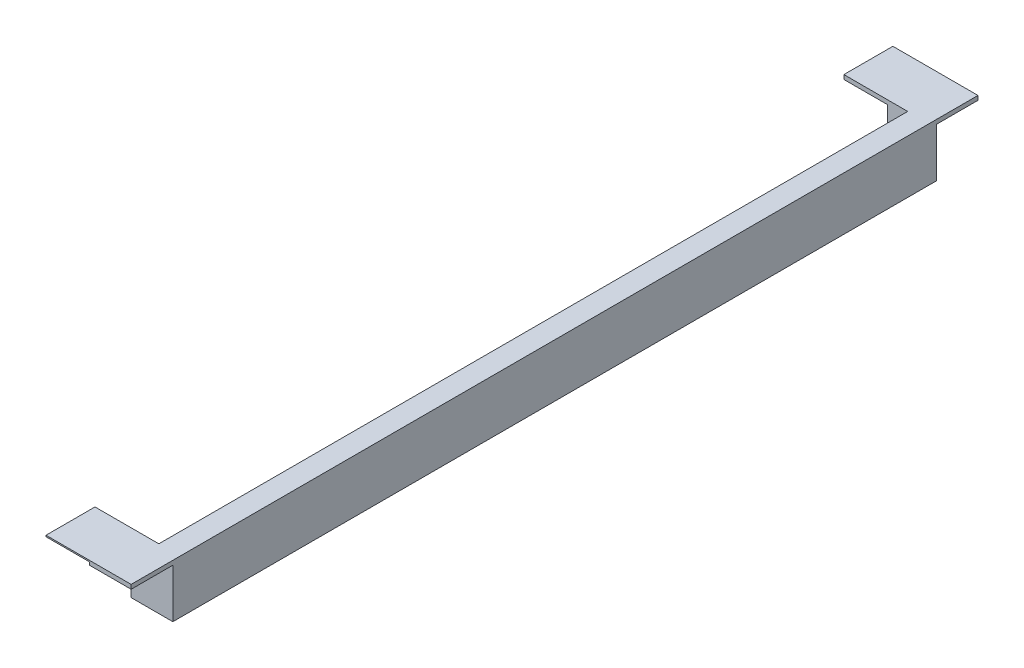
ISO-10303-21;
HEADER;
FILE_DESCRIPTION(('STEP AP214'),'2;1');
FILE_NAME('part.step','',(''),(''),'','','');
FILE_SCHEMA(('AUTOMOTIVE_DESIGN { 1 0 10303 214 1 1 1 1 }'));
ENDSEC;
DATA;
#1=APPLICATION_CONTEXT('core data for automotive mechanical design processes');
#2=APPLICATION_PROTOCOL_DEFINITION('international standard','automotive_design',2000,#1);
#3=PRODUCT_CONTEXT('',#1,'mechanical');
#4=PRODUCT('Part','Part','',(#3));
#5=PRODUCT_RELATED_PRODUCT_CATEGORY('part','',(#4));
#6=PRODUCT_DEFINITION_FORMATION('','',#4);
#7=PRODUCT_DEFINITION_CONTEXT('part definition',#1,'design');
#8=PRODUCT_DEFINITION('design','',#6,#7);
#9=PRODUCT_DEFINITION_SHAPE('','',#8);
#10=(LENGTH_UNIT() NAMED_UNIT(*) SI_UNIT(.MILLI.,.METRE.));
#11=(NAMED_UNIT(*) PLANE_ANGLE_UNIT() SI_UNIT($,.RADIAN.));
#12=(NAMED_UNIT(*) SI_UNIT($,.STERADIAN.) SOLID_ANGLE_UNIT());
#13=UNCERTAINTY_MEASURE_WITH_UNIT(LENGTH_MEASURE(1.E-05),#10,'distance_accuracy_value','');
#14=(GEOMETRIC_REPRESENTATION_CONTEXT(3) GLOBAL_UNCERTAINTY_ASSIGNED_CONTEXT((#13)) GLOBAL_UNIT_ASSIGNED_CONTEXT((#10,
#11,#12)) REPRESENTATION_CONTEXT('',''));
#15=CARTESIAN_POINT('',(0.,0.,0.));
#16=DIRECTION('',(0.,0.,1.));
#17=DIRECTION('',(1.,0.,0.));
#18=AXIS2_PLACEMENT_3D('',#15,#16,#17);
#19=CARTESIAN_POINT('',(83.5070619854824,-52.5,915.005527691364));
#20=DIRECTION('',(0.,-1.,0.));
#21=DIRECTION('',(1.,0.,0.));
#22=AXIS2_PLACEMENT_3D('',#19,#20,#21);
#23=PLANE('',#22);
#24=DIRECTION('',(0.,0.,1.));
#25=VECTOR('',#24,1.);
#26=CARTESIAN_POINT('',(33.5070619854824,-52.5,35.3555276913635));
#27=LINE('',#26,#25);
#28=CARTESIAN_POINT('',(33.5070619854824,-52.5,35.3555276913635));
#29=VERTEX_POINT('',#28);
#30=CARTESIAN_POINT('',(33.5070619854824,-52.5,1794.65552769136));
#31=VERTEX_POINT('',#30);
#32=EDGE_CURVE('E55',#29,#31,#27,.T.);
#33=ORIENTED_EDGE('',*,*,#32,.F.);
#34=DIRECTION('',(1.,0.,0.));
#35=VECTOR('',#34,1.);
#36=CARTESIAN_POINT('',(-14.4929380145176,-52.5,35.3555276913635));
#37=LINE('',#36,#35);
#38=CARTESIAN_POINT('',(-14.4929380145176,-52.5,35.3555276913637));
#39=VERTEX_POINT('',#38);
#40=EDGE_CURVE('E213',#39,#29,#37,.T.);
#41=ORIENTED_EDGE('',*,*,#40,.F.);
#42=DIRECTION('',(0.,0.,-1.));
#43=VECTOR('',#42,1.);
#44=CARTESIAN_POINT('',(-14.4929380145176,-52.5,915.005527691364));
#45=LINE('',#44,#43);
#46=CARTESIAN_POINT('',(-14.4929380145176,-52.5,1794.65552769136));
#47=VERTEX_POINT('',#46);
#48=EDGE_CURVE('E256',#47,#39,#45,.T.);
#49=ORIENTED_EDGE('',*,*,#48,.F.);
#50=DIRECTION('',(-1.,0.,0.));
#51=VECTOR('',#50,1.);
#52=CARTESIAN_POINT('',(83.5070619854824,-52.5,1794.65552769136));
#53=LINE('',#52,#51);
#54=EDGE_CURVE('E202',#31,#47,#53,.T.);
#55=ORIENTED_EDGE('',*,*,#54,.F.);
#56=EDGE_LOOP('',(#33,#41,#49,#55));
#57=FACE_BOUND('',#56,.T.);
#58=ADVANCED_FACE('F38',(#57),#23,.F.);
#59=CARTESIAN_POINT('',(0.,0.,35.3555276913635));
#60=DIRECTION('',(0.,0.,1.));
#61=DIRECTION('',(1.,0.,0.));
#62=AXIS2_PLACEMENT_3D('',#59,#60,#61);
#63=PLANE('',#62);
#64=ORIENTED_EDGE('',*,*,#40,.T.);
#65=DIRECTION('',(0.,-1.,0.));
#66=VECTOR('',#65,1.);
#67=CARTESIAN_POINT('',(33.5070619854822,1770.01036644674,35.3555276913635));
#68=LINE('',#67,#66);
#69=CARTESIAN_POINT('',(33.5070619854824,10.,35.3555276913635));
#70=VERTEX_POINT('',#69);
#71=EDGE_CURVE('E62',#70,#29,#68,.T.);
#72=ORIENTED_EDGE('',*,*,#71,.F.);
#73=DIRECTION('',(-1.,0.,0.));
#74=VECTOR('',#73,1.);
#75=CARTESIAN_POINT('',(-14.4929380145176,10.,35.3555276913635));
#76=LINE('',#75,#74);
#77=CARTESIAN_POINT('',(-116.492938014518,10.,35.3555276913636));
#78=VERTEX_POINT('',#77);
#79=EDGE_CURVE('E216',#70,#78,#76,.T.);
#80=ORIENTED_EDGE('',*,*,#79,.T.);
#81=DIRECTION('',(0.,1.,0.));
#82=VECTOR('',#81,1.);
#83=CARTESIAN_POINT('',(-116.492938014518,10.,35.3555276913636));
#84=LINE('',#83,#82);
#85=CARTESIAN_POINT('',(-116.492938014518,0.,35.3555276913635));
#86=VERTEX_POINT('',#85);
#87=EDGE_CURVE('E190',#86,#78,#84,.T.);
#88=ORIENTED_EDGE('',*,*,#87,.F.);
#89=DIRECTION('',(1.,0.,0.));
#90=VECTOR('',#89,1.);
#91=CARTESIAN_POINT('',(-116.492938014518,0.,35.3555276913635));
#92=LINE('',#91,#90);
#93=CARTESIAN_POINT('',(-14.4929380145176,0.,35.3555276913635));
#94=VERTEX_POINT('',#93);
#95=EDGE_CURVE('E197',#86,#94,#92,.T.);
#96=ORIENTED_EDGE('',*,*,#95,.T.);
#97=DIRECTION('',(0.,-1.,0.));
#98=VECTOR('',#97,1.);
#99=CARTESIAN_POINT('',(-14.4929380145176,10.,35.3555276913635));
#100=LINE('',#99,#98);
#101=EDGE_CURVE('E210',#94,#39,#100,.T.);
#102=ORIENTED_EDGE('',*,*,#101,.T.);
#103=EDGE_LOOP('',(#64,#72,#80,#88,#96,#102));
#104=FACE_BOUND('',#103,.T.);
#105=ADVANCED_FACE('F330',(#104),#63,.T.);
#106=CARTESIAN_POINT('',(0.,0.,1794.65552769136));
#107=DIRECTION('',(0.,0.,-1.));
#108=DIRECTION('',(-1.,0.,0.));
#109=AXIS2_PLACEMENT_3D('',#106,#107,#108);
#110=PLANE('',#109);
#111=DIRECTION('',(1.,0.,0.));
#112=VECTOR('',#111,1.);
#113=CARTESIAN_POINT('',(83.5070619854824,10.,1794.65552769136));
#114=LINE('',#113,#112);
#115=CARTESIAN_POINT('',(-116.492938014517,10.,1794.65552769136));
#116=VERTEX_POINT('',#115);
#117=CARTESIAN_POINT('',(33.5070619854824,10.,1794.65552769136));
#118=VERTEX_POINT('',#117);
#119=EDGE_CURVE('E207',#116,#118,#114,.T.);
#120=ORIENTED_EDGE('',*,*,#119,.T.);
#121=DIRECTION('',(0.,-1.,0.));
#122=VECTOR('',#121,1.);
#123=CARTESIAN_POINT('',(33.5070619854824,1770.01036644674,1794.65552769136));
#124=LINE('',#123,#122);
#125=EDGE_CURVE('E389',#118,#31,#124,.T.);
#126=ORIENTED_EDGE('',*,*,#125,.T.);
#127=ORIENTED_EDGE('',*,*,#54,.T.);
#128=DIRECTION('',(0.,1.,0.));
#129=VECTOR('',#128,1.);
#130=CARTESIAN_POINT('',(-14.4929380145176,10.,1794.65552769136));
#131=LINE('',#130,#129);
#132=CARTESIAN_POINT('',(-14.4929380145173,6.8,1794.65552769136));
#133=VERTEX_POINT('',#132);
#134=EDGE_CURVE('E175',#47,#133,#131,.T.);
#135=ORIENTED_EDGE('',*,*,#134,.T.);
#136=DIRECTION('',(1.,0.,0.));
#137=VECTOR('',#136,1.);
#138=CARTESIAN_POINT('',(-116.492938014517,6.8,1794.65552769136));
#139=LINE('',#138,#137);
#140=CARTESIAN_POINT('',(-116.492938014517,6.8,1794.65552769136));
#141=VERTEX_POINT('',#140);
#142=EDGE_CURVE('E152',#141,#133,#139,.T.);
#143=ORIENTED_EDGE('',*,*,#142,.F.);
#144=DIRECTION('',(0.,-1.,0.));
#145=VECTOR('',#144,1.);
#146=CARTESIAN_POINT('',(-116.492938014517,10.,1794.65552769136));
#147=LINE('',#146,#145);
#148=EDGE_CURVE('E161',#116,#141,#147,.T.);
#149=ORIENTED_EDGE('',*,*,#148,.F.);
#150=EDGE_LOOP('',(#120,#126,#127,#135,#143,#149));
#151=FACE_BOUND('',#150,.T.);
#152=ADVANCED_FACE('F173',(#151),#110,.T.);
#153=CARTESIAN_POINT('',(-14.4929380145176,10.,-79.7444723086365));
#154=DIRECTION('',(1.,0.,0.));
#155=DIRECTION('',(0.,0.,-1.));
#156=AXIS2_PLACEMENT_3D('',#153,#154,#155);
#157=PLANE('',#156);
#158=DIRECTION('',(0.,0.,1.));
#159=VECTOR('',#158,1.);
#160=CARTESIAN_POINT('',(-14.4929380145173,6.8,1794.65552769136));
#161=LINE('',#160,#159);
#162=CARTESIAN_POINT('',(-14.4929380145173,6.8,1909.75552769136));
#163=VERTEX_POINT('',#162);
#164=EDGE_CURVE('E170',#133,#163,#161,.T.);
#165=ORIENTED_EDGE('',*,*,#164,.F.);
#166=ORIENTED_EDGE('',*,*,#134,.F.);
#167=ORIENTED_EDGE('',*,*,#48,.T.);
#168=ORIENTED_EDGE('',*,*,#101,.F.);
#169=DIRECTION('',(0.,0.,1.));
#170=VECTOR('',#169,1.);
#171=CARTESIAN_POINT('',(-14.4929380145176,0.,-79.7444723086365));
#172=LINE('',#171,#170);
#173=CARTESIAN_POINT('',(-14.4929380145176,0.,18.2555276913635));
#174=VERTEX_POINT('',#173);
#175=EDGE_CURVE('E11',#174,#94,#172,.T.);
#176=ORIENTED_EDGE('',*,*,#175,.F.);
#177=DIRECTION('',(0.,-1.,0.));
#178=VECTOR('',#177,1.);
#179=CARTESIAN_POINT('',(-14.4929380145176,10.,18.2555276913635));
#180=LINE('',#179,#178);
#181=CARTESIAN_POINT('',(-14.4929380145175,-115.,18.2555276913635));
#182=VERTEX_POINT('',#181);
#183=EDGE_CURVE('E260',#174,#182,#180,.T.);
#184=ORIENTED_EDGE('',*,*,#183,.T.);
#185=DIRECTION('',(0.,0.,-1.));
#186=VECTOR('',#185,1.);
#187=CARTESIAN_POINT('',(-14.4929380145175,-115.,28.2555276913635));
#188=LINE('',#187,#186);
#189=CARTESIAN_POINT('',(-14.4929380145175,-115.,1811.75552769136));
#190=VERTEX_POINT('',#189);
#191=EDGE_CURVE('E274',#190,#182,#188,.T.);
#192=ORIENTED_EDGE('',*,*,#191,.F.);
#193=DIRECTION('',(0.,-1.,0.));
#194=VECTOR('',#193,1.);
#195=CARTESIAN_POINT('',(-14.4929380145176,10.,1811.75552769136));
#196=LINE('',#195,#194);
#197=CARTESIAN_POINT('',(-14.4929380145176,0.,1811.75552769136));
#198=VERTEX_POINT('',#197);
#199=EDGE_CURVE('E219',#198,#190,#196,.T.);
#200=ORIENTED_EDGE('',*,*,#199,.F.);
#201=DIRECTION('',(0.,0.,-1.));
#202=VECTOR('',#201,1.);
#203=CARTESIAN_POINT('',(-14.4929380145176,0.,1909.75552769136));
#204=LINE('',#203,#202);
#205=CARTESIAN_POINT('',(-14.4929380145176,0.,1909.75552769136));
#206=VERTEX_POINT('',#205);
#207=EDGE_CURVE('E231',#206,#198,#204,.T.);
#208=ORIENTED_EDGE('',*,*,#207,.F.);
#209=DIRECTION('',(0.,-1.,0.));
#210=VECTOR('',#209,1.);
#211=CARTESIAN_POINT('',(-14.4929380145176,10.,1909.75552769136));
#212=LINE('',#211,#210);
#213=EDGE_CURVE('E235',#163,#206,#212,.T.);
#214=ORIENTED_EDGE('',*,*,#213,.F.);
#215=EDGE_LOOP('',(#165,#166,#167,#168,#176,#184,#192,#200,#208,#214));
#216=FACE_BOUND('',#215,.T.);
#217=ADVANCED_FACE('F40',(#216),#157,.F.);
#218=CARTESIAN_POINT('',(83.5070619854824,10.,-79.7444723086365));
#219=DIRECTION('',(-1.,0.,0.));
#220=DIRECTION('',(0.,0.,1.));
#221=AXIS2_PLACEMENT_3D('',#218,#219,#220);
#222=PLANE('',#221);
#223=DIRECTION('',(0.,0.,-1.));
#224=VECTOR('',#223,1.);
#225=CARTESIAN_POINT('',(83.5070619854824,10.,-79.7444723086365));
#226=LINE('',#225,#224);
#227=CARTESIAN_POINT('',(83.5070619854824,10.,1909.75552769136));
#228=VERTEX_POINT('',#227);
#229=CARTESIAN_POINT('',(83.5070619854824,10.,-79.7444723086365));
#230=VERTEX_POINT('',#229);
#231=EDGE_CURVE('E279',#228,#230,#226,.T.);
#232=ORIENTED_EDGE('',*,*,#231,.F.);
#233=DIRECTION('',(0.,-1.,0.));
#234=VECTOR('',#233,1.);
#235=CARTESIAN_POINT('',(83.5070619854824,10.,1909.75552769136));
#236=LINE('',#235,#234);
#237=CARTESIAN_POINT('',(83.5070619854824,0.,1909.75552769136));
#238=VERTEX_POINT('',#237);
#239=EDGE_CURVE('E252',#228,#238,#236,.T.);
#240=ORIENTED_EDGE('',*,*,#239,.T.);
#241=DIRECTION('',(0.,0.,1.));
#242=VECTOR('',#241,1.);
#243=CARTESIAN_POINT('',(83.5070619854824,0.,1909.75552769136));
#244=LINE('',#243,#242);
#245=CARTESIAN_POINT('',(83.5070619854824,0.,1811.75552769136));
#246=VERTEX_POINT('',#245);
#247=EDGE_CURVE('E243',#246,#238,#244,.T.);
#248=ORIENTED_EDGE('',*,*,#247,.F.);
#249=DIRECTION('',(0.,1.,0.));
#250=VECTOR('',#249,1.);
#251=CARTESIAN_POINT('',(83.5070619854824,10.,1811.75552769136));
#252=LINE('',#251,#250);
#253=CARTESIAN_POINT('',(83.5070619854824,-115.,1811.75552769136));
#254=VERTEX_POINT('',#253);
#255=EDGE_CURVE('E227',#254,#246,#252,.T.);
#256=ORIENTED_EDGE('',*,*,#255,.F.);
#257=DIRECTION('',(0.,0.,-1.));
#258=VECTOR('',#257,1.);
#259=CARTESIAN_POINT('',(83.5070619854824,-115.,28.2555276913635));
#260=LINE('',#259,#258);
#261=CARTESIAN_POINT('',(83.5070619854824,-115.,18.2555276913635));
#262=VERTEX_POINT('',#261);
#263=EDGE_CURVE('E270',#254,#262,#260,.T.);
#264=ORIENTED_EDGE('',*,*,#263,.T.);
#265=DIRECTION('',(0.,1.,0.));
#266=VECTOR('',#265,1.);
#267=CARTESIAN_POINT('',(83.5070619854824,10.,18.2555276913635));
#268=LINE('',#267,#266);
#269=CARTESIAN_POINT('',(83.5070619854824,0.,18.2555276913635));
#270=VERTEX_POINT('',#269);
#271=EDGE_CURVE('E266',#262,#270,#268,.T.);
#272=ORIENTED_EDGE('',*,*,#271,.T.);
#273=DIRECTION('',(0.,0.,-1.));
#274=VECTOR('',#273,1.);
#275=CARTESIAN_POINT('',(83.5070619854824,0.,-79.7444723086365));
#276=LINE('',#275,#274);
#277=CARTESIAN_POINT('',(83.5070619854824,0.,-79.7444723086365));
#278=VERTEX_POINT('',#277);
#279=EDGE_CURVE('E289',#270,#278,#276,.T.);
#280=ORIENTED_EDGE('',*,*,#279,.T.);
#281=DIRECTION('',(0.,-1.,0.));
#282=VECTOR('',#281,1.);
#283=CARTESIAN_POINT('',(83.5070619854824,10.,-79.7444723086365));
#284=LINE('',#283,#282);
#285=EDGE_CURVE('E42',#230,#278,#284,.T.);
#286=ORIENTED_EDGE('',*,*,#285,.F.);
#287=EDGE_LOOP('',(#232,#240,#248,#256,#264,#272,#280,#286));
#288=FACE_BOUND('',#287,.T.);
#289=ADVANCED_FACE('F316',(#288),#222,.F.);
#290=CARTESIAN_POINT('',(-14.4929380145176,10.,-79.7444723086365));
#291=DIRECTION('',(0.,0.,1.));
#292=DIRECTION('',(1.,0.,0.));
#293=AXIS2_PLACEMENT_3D('',#290,#291,#292);
#294=PLANE('',#293);
#295=DIRECTION('',(-1.,0.,0.));
#296=VECTOR('',#295,1.);
#297=CARTESIAN_POINT('',(-14.4929380145176,0.,-79.7444723086365));
#298=LINE('',#297,#296);
#299=CARTESIAN_POINT('',(-116.492938014518,0.,-79.7444723086365));
#300=VERTEX_POINT('',#299);
#301=EDGE_CURVE('E283',#278,#300,#298,.T.);
#302=ORIENTED_EDGE('',*,*,#301,.T.);
#303=DIRECTION('',(0.,-1.,0.));
#304=VECTOR('',#303,1.);
#305=CARTESIAN_POINT('',(-116.492938014518,10.,-79.7444723086365));
#306=LINE('',#305,#304);
#307=CARTESIAN_POINT('',(-116.492938014518,10.,-79.7444723086365));
#308=VERTEX_POINT('',#307);
#309=EDGE_CURVE('E177',#308,#300,#306,.T.);
#310=ORIENTED_EDGE('',*,*,#309,.F.);
#311=DIRECTION('',(-1.,0.,0.));
#312=VECTOR('',#311,1.);
#313=CARTESIAN_POINT('',(-14.4929380145176,10.,-79.7444723086365));
#314=LINE('',#313,#312);
#315=EDGE_CURVE('E282',#230,#308,#314,.T.);
#316=ORIENTED_EDGE('',*,*,#315,.F.);
#317=ORIENTED_EDGE('',*,*,#285,.T.);
#318=EDGE_LOOP('',(#302,#310,#316,#317));
#319=FACE_BOUND('',#318,.T.);
#320=ADVANCED_FACE('F298',(#319),#294,.F.);
#321=CARTESIAN_POINT('',(0.,10.,0.));
#322=DIRECTION('',(0.,1.,0.));
#323=DIRECTION('',(0.,0.,1.));
#324=AXIS2_PLACEMENT_3D('',#321,#322,#323);
#325=PLANE('',#324);
#326=ORIENTED_EDGE('',*,*,#315,.T.);
#327=DIRECTION('',(0.,0.,-1.));
#328=VECTOR('',#327,1.);
#329=CARTESIAN_POINT('',(-116.492938014518,10.,-79.7444723086365));
#330=LINE('',#329,#328);
#331=EDGE_CURVE('E194',#78,#308,#330,.T.);
#332=ORIENTED_EDGE('',*,*,#331,.F.);
#333=ORIENTED_EDGE('',*,*,#79,.F.);
#334=DIRECTION('',(0.,0.,1.));
#335=VECTOR('',#334,1.);
#336=CARTESIAN_POINT('',(33.5070619854824,10.,35.3555276913635));
#337=LINE('',#336,#335);
#338=EDGE_CURVE('E386',#70,#118,#337,.T.);
#339=ORIENTED_EDGE('',*,*,#338,.T.);
#340=ORIENTED_EDGE('',*,*,#119,.F.);
#341=DIRECTION('',(0.,0.,-1.));
#342=VECTOR('',#341,1.);
#343=CARTESIAN_POINT('',(-116.492938014517,10.,1794.65552769136));
#344=LINE('',#343,#342);
#345=CARTESIAN_POINT('',(-116.492938014517,10.,1909.75552769136));
#346=VERTEX_POINT('',#345);
#347=EDGE_CURVE('E167',#346,#116,#344,.T.);
#348=ORIENTED_EDGE('',*,*,#347,.F.);
#349=DIRECTION('',(-1.,0.,0.));
#350=VECTOR('',#349,1.);
#351=CARTESIAN_POINT('',(-14.4929380145176,10.,1909.75552769136));
#352=LINE('',#351,#350);
#353=EDGE_CURVE('E232',#228,#346,#352,.T.);
#354=ORIENTED_EDGE('',*,*,#353,.F.);
#355=ORIENTED_EDGE('',*,*,#231,.T.);
#356=EDGE_LOOP('',(#326,#332,#333,#339,#340,#348,#354,#355));
#357=FACE_BOUND('',#356,.T.);
#358=ADVANCED_FACE('F310',(#357),#325,.T.);
#359=CARTESIAN_POINT('',(0.,0.,0.));
#360=DIRECTION('',(0.,1.,0.));
#361=DIRECTION('',(0.,0.,1.));
#362=AXIS2_PLACEMENT_3D('',#359,#360,#361);
#363=PLANE('',#362);
#364=DIRECTION('',(1.,0.,0.));
#365=VECTOR('',#364,1.);
#366=CARTESIAN_POINT('',(-14.4929380145176,0.,18.2555276913635));
#367=LINE('',#366,#365);
#368=EDGE_CURVE('E278',#174,#270,#367,.T.);
#369=ORIENTED_EDGE('',*,*,#368,.F.);
#370=ORIENTED_EDGE('',*,*,#175,.T.);
#371=ORIENTED_EDGE('',*,*,#95,.F.);
#372=DIRECTION('',(0.,0.,1.));
#373=VECTOR('',#372,1.);
#374=CARTESIAN_POINT('',(-116.492938014518,0.,-79.7444723086365));
#375=LINE('',#374,#373);
#376=EDGE_CURVE('E183',#300,#86,#375,.T.);
#377=ORIENTED_EDGE('',*,*,#376,.F.);
#378=ORIENTED_EDGE('',*,*,#301,.F.);
#379=ORIENTED_EDGE('',*,*,#279,.F.);
#380=EDGE_LOOP('',(#369,#370,#371,#377,#378,#379));
#381=FACE_BOUND('',#380,.T.);
#382=ADVANCED_FACE('F304',(#381),#363,.F.);
#383=CARTESIAN_POINT('',(0.,0.,18.2555276913635));
#384=DIRECTION('',(0.,0.,1.));
#385=DIRECTION('',(1.,0.,0.));
#386=AXIS2_PLACEMENT_3D('',#383,#384,#385);
#387=PLANE('',#386);
#388=ORIENTED_EDGE('',*,*,#183,.F.);
#389=ORIENTED_EDGE('',*,*,#368,.T.);
#390=ORIENTED_EDGE('',*,*,#271,.F.);
#391=DIRECTION('',(1.,0.,0.));
#392=VECTOR('',#391,1.);
#393=CARTESIAN_POINT('',(-14.4929380145175,-115.,18.2555276913635));
#394=LINE('',#393,#392);
#395=EDGE_CURVE('E263',#182,#262,#394,.T.);
#396=ORIENTED_EDGE('',*,*,#395,.F.);
#397=EDGE_LOOP('',(#388,#389,#390,#396));
#398=FACE_BOUND('',#397,.T.);
#399=ADVANCED_FACE('F325',(#398),#387,.F.);
#400=CARTESIAN_POINT('',(-14.4929380145175,-115.,28.2555276913635));
#401=DIRECTION('',(0.,1.,0.));
#402=DIRECTION('',(0.,0.,1.));
#403=AXIS2_PLACEMENT_3D('',#400,#401,#402);
#404=PLANE('',#403);
#405=ORIENTED_EDGE('',*,*,#395,.T.);
#406=ORIENTED_EDGE('',*,*,#263,.F.);
#407=DIRECTION('',(1.,0.,0.));
#408=VECTOR('',#407,1.);
#409=CARTESIAN_POINT('',(-14.4929380145175,-115.,1811.75552769136));
#410=LINE('',#409,#408);
#411=EDGE_CURVE('E223',#190,#254,#410,.T.);
#412=ORIENTED_EDGE('',*,*,#411,.F.);
#413=ORIENTED_EDGE('',*,*,#191,.T.);
#414=EDGE_LOOP('',(#405,#406,#412,#413));
#415=FACE_BOUND('',#414,.T.);
#416=ADVANCED_FACE('F344',(#415),#404,.F.);
#417=CARTESIAN_POINT('',(-14.4929380145176,10.,1909.75552769136));
#418=DIRECTION('',(0.,0.,-1.));
#419=DIRECTION('',(1.,0.,0.));
#420=AXIS2_PLACEMENT_3D('',#417,#418,#419);
#421=PLANE('',#420);
#422=DIRECTION('',(-1.,0.,0.));
#423=VECTOR('',#422,1.);
#424=CARTESIAN_POINT('',(-14.4929380145176,0.,1909.75552769136));
#425=LINE('',#424,#423);
#426=EDGE_CURVE('E236',#238,#206,#425,.T.);
#427=ORIENTED_EDGE('',*,*,#426,.F.);
#428=ORIENTED_EDGE('',*,*,#239,.F.);
#429=ORIENTED_EDGE('',*,*,#353,.T.);
#430=DIRECTION('',(0.,1.,0.));
#431=VECTOR('',#430,1.);
#432=CARTESIAN_POINT('',(-116.492938014517,10.,1909.75552769136));
#433=LINE('',#432,#431);
#434=CARTESIAN_POINT('',(-116.492938014517,6.8,1909.75552769136));
#435=VERTEX_POINT('',#434);
#436=EDGE_CURVE('E160',#435,#346,#433,.T.);
#437=ORIENTED_EDGE('',*,*,#436,.F.);
#438=DIRECTION('',(1.,0.,0.));
#439=VECTOR('',#438,1.);
#440=CARTESIAN_POINT('',(-116.492938014517,6.8,1909.75552769136));
#441=LINE('',#440,#439);
#442=EDGE_CURVE('E155',#435,#163,#441,.T.);
#443=ORIENTED_EDGE('',*,*,#442,.T.);
#444=ORIENTED_EDGE('',*,*,#213,.T.);
#445=EDGE_LOOP('',(#427,#428,#429,#437,#443,#444));
#446=FACE_BOUND('',#445,.T.);
#447=ADVANCED_FACE('F340',(#446),#421,.F.);
#448=CARTESIAN_POINT('',(0.,0.,1830.01105538273));
#449=DIRECTION('',(0.,1.,0.));
#450=DIRECTION('',(0.,0.,-1.));
#451=AXIS2_PLACEMENT_3D('',#448,#449,#450);
#452=PLANE('',#451);
#453=ORIENTED_EDGE('',*,*,#207,.T.);
#454=DIRECTION('',(1.,0.,0.));
#455=VECTOR('',#454,1.);
#456=CARTESIAN_POINT('',(-14.4929380145176,0.,1811.75552769136));
#457=LINE('',#456,#455);
#458=EDGE_CURVE('E240',#198,#246,#457,.T.);
#459=ORIENTED_EDGE('',*,*,#458,.T.);
#460=ORIENTED_EDGE('',*,*,#247,.T.);
#461=ORIENTED_EDGE('',*,*,#426,.T.);
#462=EDGE_LOOP('',(#453,#459,#460,#461));
#463=FACE_BOUND('',#462,.T.);
#464=ADVANCED_FACE('F368',(#463),#452,.F.);
#465=CARTESIAN_POINT('',(0.,0.,1811.75552769136));
#466=DIRECTION('',(0.,0.,-1.));
#467=DIRECTION('',(1.,0.,0.));
#468=AXIS2_PLACEMENT_3D('',#465,#466,#467);
#469=PLANE('',#468);
#470=ORIENTED_EDGE('',*,*,#199,.T.);
#471=ORIENTED_EDGE('',*,*,#411,.T.);
#472=ORIENTED_EDGE('',*,*,#255,.T.);
#473=ORIENTED_EDGE('',*,*,#458,.F.);
#474=EDGE_LOOP('',(#470,#471,#472,#473));
#475=FACE_BOUND('',#474,.T.);
#476=ADVANCED_FACE('F366',(#475),#469,.F.);
#477=CARTESIAN_POINT('',(-116.492938014518,0.,0.));
#478=DIRECTION('',(-1.,0.,0.));
#479=DIRECTION('',(0.,0.,1.));
#480=AXIS2_PLACEMENT_3D('',#477,#478,#479);
#481=PLANE('',#480);
#482=ORIENTED_EDGE('',*,*,#309,.T.);
#483=ORIENTED_EDGE('',*,*,#376,.T.);
#484=ORIENTED_EDGE('',*,*,#87,.T.);
#485=ORIENTED_EDGE('',*,*,#331,.T.);
#486=EDGE_LOOP('',(#482,#483,#484,#485));
#487=FACE_BOUND('',#486,.T.);
#488=ADVANCED_FACE('F307',(#487),#481,.T.);
#489=CARTESIAN_POINT('',(-116.492938014517,6.8,1794.65552769136));
#490=DIRECTION('',(0.,1.,0.));
#491=DIRECTION('',(0.,0.,1.));
#492=AXIS2_PLACEMENT_3D('',#489,#490,#491);
#493=PLANE('',#492);
#494=ORIENTED_EDGE('',*,*,#164,.T.);
#495=ORIENTED_EDGE('',*,*,#442,.F.);
#496=DIRECTION('',(0.,0.,1.));
#497=VECTOR('',#496,1.);
#498=CARTESIAN_POINT('',(-116.492938014517,6.8,1794.65552769136));
#499=LINE('',#498,#497);
#500=EDGE_CURVE('E148',#141,#435,#499,.T.);
#501=ORIENTED_EDGE('',*,*,#500,.F.);
#502=ORIENTED_EDGE('',*,*,#142,.T.);
#503=EDGE_LOOP('',(#494,#495,#501,#502));
#504=FACE_BOUND('',#503,.T.);
#505=ADVANCED_FACE('F150',(#504),#493,.F.);
#506=CARTESIAN_POINT('',(-116.492938014518,0.,0.));
#507=DIRECTION('',(-1.,0.,0.));
#508=DIRECTION('',(0.,0.,1.));
#509=AXIS2_PLACEMENT_3D('',#506,#507,#508);
#510=PLANE('',#509);
#511=ORIENTED_EDGE('',*,*,#148,.T.);
#512=ORIENTED_EDGE('',*,*,#500,.T.);
#513=ORIENTED_EDGE('',*,*,#436,.T.);
#514=ORIENTED_EDGE('',*,*,#347,.T.);
#515=EDGE_LOOP('',(#511,#512,#513,#514));
#516=FACE_BOUND('',#515,.T.);
#517=ADVANCED_FACE('F165',(#516),#510,.T.);
#518=CARTESIAN_POINT('',(33.5070619854822,1770.01036644674,35.3555276913635));
#519=DIRECTION('',(1.,0.,0.));
#520=DIRECTION('',(0.,1.,0.));
#521=AXIS2_PLACEMENT_3D('',#518,#519,#520);
#522=PLANE('',#521);
#523=ORIENTED_EDGE('',*,*,#338,.F.);
#524=ORIENTED_EDGE('',*,*,#71,.T.);
#525=ORIENTED_EDGE('',*,*,#32,.T.);
#526=ORIENTED_EDGE('',*,*,#125,.F.);
#527=EDGE_LOOP('',(#523,#524,#525,#526));
#528=FACE_BOUND('',#527,.T.);
#529=ADVANCED_FACE('F402',(#528),#522,.F.);
#530=CLOSED_SHELL('',(#58,#105,#152,#217,#289,#320,#358,#382,#399,#416,#447,#464,#476,#488,#505,
#517,#529));
#531=MANIFOLD_SOLID_BREP('B2',#530);
#532=ADVANCED_BREP_SHAPE_REPRESENTATION('',(#18,#531),#14);
#533=SHAPE_DEFINITION_REPRESENTATION(#9,#532);
ENDSEC;
END-ISO-10303-21;
